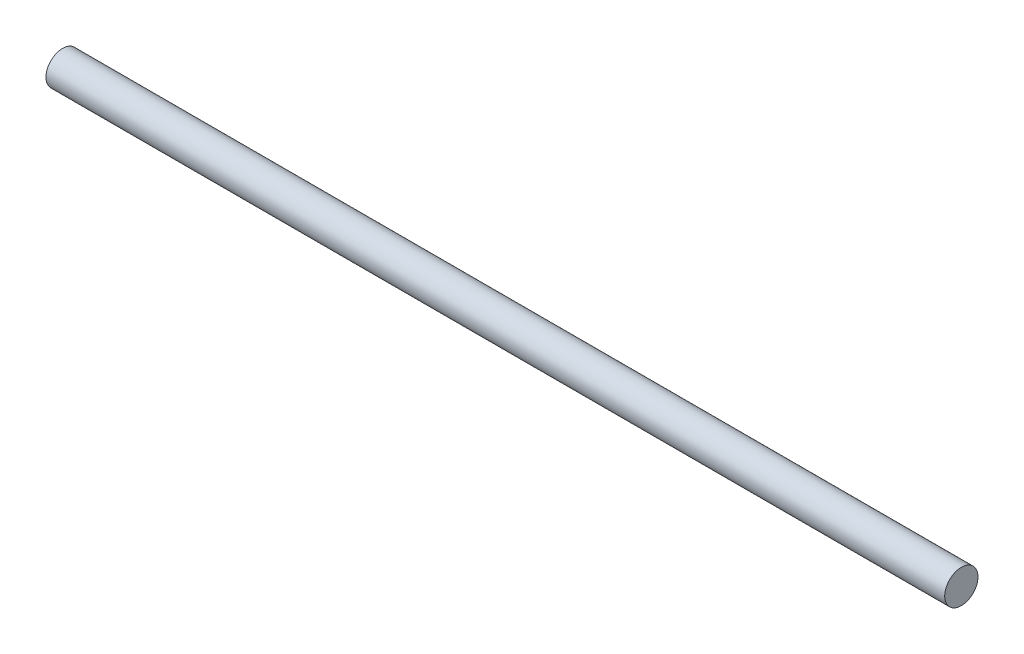
ISO-10303-21;
HEADER;
FILE_DESCRIPTION(('STEP AP214'),'2;1');
FILE_NAME('part.step','',(''),(''),'','','');
FILE_SCHEMA(('AUTOMOTIVE_DESIGN { 1 0 10303 214 1 1 1 1 }'));
ENDSEC;
DATA;
#1=APPLICATION_CONTEXT('core data for automotive mechanical design processes');
#2=APPLICATION_PROTOCOL_DEFINITION('international standard','automotive_design',2000,#1);
#3=PRODUCT_CONTEXT('',#1,'mechanical');
#4=PRODUCT('Part','Part','',(#3));
#5=PRODUCT_RELATED_PRODUCT_CATEGORY('part','',(#4));
#6=PRODUCT_DEFINITION_FORMATION('','',#4);
#7=PRODUCT_DEFINITION_CONTEXT('part definition',#1,'design');
#8=PRODUCT_DEFINITION('design','',#6,#7);
#9=PRODUCT_DEFINITION_SHAPE('','',#8);
#10=(LENGTH_UNIT() NAMED_UNIT(*) SI_UNIT(.MILLI.,.METRE.));
#11=(NAMED_UNIT(*) PLANE_ANGLE_UNIT() SI_UNIT($,.RADIAN.));
#12=(NAMED_UNIT(*) SI_UNIT($,.STERADIAN.) SOLID_ANGLE_UNIT());
#13=UNCERTAINTY_MEASURE_WITH_UNIT(LENGTH_MEASURE(1.E-05),#10,'distance_accuracy_value','');
#14=(GEOMETRIC_REPRESENTATION_CONTEXT(3) GLOBAL_UNCERTAINTY_ASSIGNED_CONTEXT((#13)) GLOBAL_UNIT_ASSIGNED_CONTEXT((#10,
#11,#12)) REPRESENTATION_CONTEXT('',''));
#15=CARTESIAN_POINT('',(0.,0.,0.));
#16=DIRECTION('',(0.,0.,1.));
#17=DIRECTION('',(1.,0.,0.));
#18=AXIS2_PLACEMENT_3D('',#15,#16,#17);
#19=CARTESIAN_POINT('',(135.,0.,0.));
#20=DIRECTION('',(-1.,0.,0.));
#21=DIRECTION('',(0.,0.,1.));
#22=AXIS2_PLACEMENT_3D('',#19,#20,#21);
#23=CYLINDRICAL_SURFACE('',#22,2.5);
#24=CARTESIAN_POINT('',(135.,0.,0.));
#25=DIRECTION('',(1.,0.,0.));
#26=DIRECTION('',(0.,0.,-1.));
#27=AXIS2_PLACEMENT_3D('',#24,#25,#26);
#28=CIRCLE('',#27,2.5);
#29=CARTESIAN_POINT('',(135.,0.,-2.5));
#30=VERTEX_POINT('',#29);
#31=EDGE_CURVE('E10',#30,#30,#28,.T.);
#32=ORIENTED_EDGE('',*,*,#31,.F.);
#33=EDGE_LOOP('',(#32));
#34=FACE_BOUND('',#33,.T.);
#35=CARTESIAN_POINT('',(0.,0.,0.));
#36=DIRECTION('',(1.,0.,0.));
#37=DIRECTION('',(0.,0.,-1.));
#38=AXIS2_PLACEMENT_3D('',#35,#36,#37);
#39=CIRCLE('',#38,2.5);
#40=CARTESIAN_POINT('',(0.,0.,-2.5));
#41=VERTEX_POINT('',#40);
#42=EDGE_CURVE('E35',#41,#41,#39,.T.);
#43=ORIENTED_EDGE('',*,*,#42,.T.);
#44=EDGE_LOOP('',(#43));
#45=FACE_BOUND('',#44,.T.);
#46=ADVANCED_FACE('F32',(#34,#45),#23,.T.);
#47=CARTESIAN_POINT('',(135.,0.,0.));
#48=DIRECTION('',(1.,0.,0.));
#49=DIRECTION('',(0.,0.,-1.));
#50=AXIS2_PLACEMENT_3D('',#47,#48,#49);
#51=PLANE('',#50);
#52=ORIENTED_EDGE('',*,*,#31,.T.);
#53=EDGE_LOOP('',(#52));
#54=FACE_BOUND('',#53,.T.);
#55=ADVANCED_FACE('F47',(#54),#51,.T.);
#56=CARTESIAN_POINT('',(0.,0.,0.));
#57=DIRECTION('',(1.,0.,0.));
#58=DIRECTION('',(0.,0.,-1.));
#59=AXIS2_PLACEMENT_3D('',#56,#57,#58);
#60=PLANE('',#59);
#61=ORIENTED_EDGE('',*,*,#42,.F.);
#62=EDGE_LOOP('',(#61));
#63=FACE_BOUND('',#62,.T.);
#64=ADVANCED_FACE('F45',(#63),#60,.F.);
#65=CLOSED_SHELL('',(#46,#55,#64));
#66=MANIFOLD_SOLID_BREP('B2',#65);
#67=ADVANCED_BREP_SHAPE_REPRESENTATION('',(#18,#66),#14);
#68=SHAPE_DEFINITION_REPRESENTATION(#9,#67);
ENDSEC;
END-ISO-10303-21;
